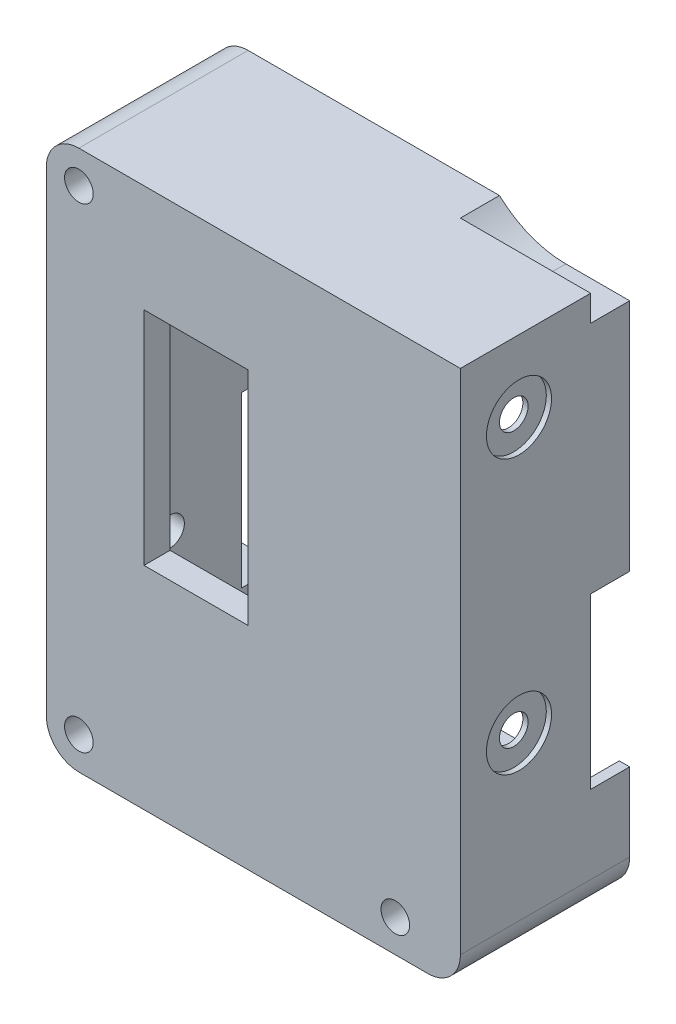
ISO-10303-21;
HEADER;
FILE_DESCRIPTION(('STEP AP214'),'2;1');
FILE_NAME('part.step','',(''),(''),'','','');
FILE_SCHEMA(('AUTOMOTIVE_DESIGN { 1 0 10303 214 1 1 1 1 }'));
ENDSEC;
DATA;
#1=APPLICATION_CONTEXT('core data for automotive mechanical design processes');
#2=APPLICATION_PROTOCOL_DEFINITION('international standard','automotive_design',2000,#1);
#3=PRODUCT_CONTEXT('',#1,'mechanical');
#4=PRODUCT('Part','Part','',(#3));
#5=PRODUCT_RELATED_PRODUCT_CATEGORY('part','',(#4));
#6=PRODUCT_DEFINITION_FORMATION('','',#4);
#7=PRODUCT_DEFINITION_CONTEXT('part definition',#1,'design');
#8=PRODUCT_DEFINITION('design','',#6,#7);
#9=PRODUCT_DEFINITION_SHAPE('','',#8);
#10=(LENGTH_UNIT() NAMED_UNIT(*) SI_UNIT(.MILLI.,.METRE.));
#11=(NAMED_UNIT(*) PLANE_ANGLE_UNIT() SI_UNIT($,.RADIAN.));
#12=(NAMED_UNIT(*) SI_UNIT($,.STERADIAN.) SOLID_ANGLE_UNIT());
#13=UNCERTAINTY_MEASURE_WITH_UNIT(LENGTH_MEASURE(1.E-05),#10,'distance_accuracy_value','');
#14=(GEOMETRIC_REPRESENTATION_CONTEXT(3) GLOBAL_UNCERTAINTY_ASSIGNED_CONTEXT((#13)) GLOBAL_UNIT_ASSIGNED_CONTEXT((#10,
#11,#12)) REPRESENTATION_CONTEXT('',''));
#15=CARTESIAN_POINT('',(0.,0.,0.));
#16=DIRECTION('',(0.,0.,1.));
#17=DIRECTION('',(1.,0.,0.));
#18=AXIS2_PLACEMENT_3D('',#15,#16,#17);
#19=CARTESIAN_POINT('',(24.3,-3.5,0.));
#20=DIRECTION('',(0.,0.,-1.));
#21=DIRECTION('',(-1.,0.,0.));
#22=AXIS2_PLACEMENT_3D('',#19,#20,#21);
#23=PLANE('',#22);
#24=CARTESIAN_POINT('',(-2.5,-3.5,0.));
#25=DIRECTION('',(0.,0.,1.));
#26=DIRECTION('',(1.,0.,0.));
#27=AXIS2_PLACEMENT_3D('',#24,#25,#26);
#28=CIRCLE('',#27,1.1);
#29=CARTESIAN_POINT('',(-1.4,-3.5,0.));
#30=VERTEX_POINT('',#29);
#31=EDGE_CURVE('E417',#30,#30,#28,.T.);
#32=ORIENTED_EDGE('',*,*,#31,.T.);
#33=EDGE_LOOP('',(#32));
#34=FACE_BOUND('',#33,.T.);
#35=CARTESIAN_POINT('',(-2.5,33.,0.));
#36=DIRECTION('',(0.,0.,1.));
#37=DIRECTION('',(1.,0.,0.));
#38=AXIS2_PLACEMENT_3D('',#35,#36,#37);
#39=CIRCLE('',#38,1.1);
#40=CARTESIAN_POINT('',(-1.4,33.,0.));
#41=VERTEX_POINT('',#40);
#42=EDGE_CURVE('E420',#41,#41,#39,.T.);
#43=ORIENTED_EDGE('',*,*,#42,.T.);
#44=EDGE_LOOP('',(#43));
#45=FACE_BOUND('',#44,.T.);
#46=CARTESIAN_POINT('',(21.8,-3.5,0.));
#47=DIRECTION('',(0.,0.,1.));
#48=DIRECTION('',(1.,0.,0.));
#49=AXIS2_PLACEMENT_3D('',#46,#47,#48);
#50=CIRCLE('',#49,1.1);
#51=CARTESIAN_POINT('',(22.9,-3.5,0.));
#52=VERTEX_POINT('',#51);
#53=EDGE_CURVE('E414',#52,#52,#50,.T.);
#54=ORIENTED_EDGE('',*,*,#53,.T.);
#55=EDGE_LOOP('',(#54));
#56=FACE_BOUND('',#55,.T.);
#57=DIRECTION('',(0.,1.,0.));
#58=VECTOR('',#57,1.);
#59=CARTESIAN_POINT('',(26.,0.,0.));
#60=LINE('',#59,#58);
#61=CARTESIAN_POINT('',(26.,0.,0.));
#62=VERTEX_POINT('',#61);
#63=CARTESIAN_POINT('',(26.,2.5,0.));
#64=VERTEX_POINT('',#63);
#65=EDGE_CURVE('E225',#62,#64,#60,.T.);
#66=ORIENTED_EDGE('',*,*,#65,.T.);
#67=DIRECTION('',(-1.,0.,0.));
#68=VECTOR('',#67,1.);
#69=CARTESIAN_POINT('',(26.8,2.5,0.));
#70=LINE('',#69,#68);
#71=CARTESIAN_POINT('',(26.8,2.5,0.));
#72=VERTEX_POINT('',#71);
#73=EDGE_CURVE('E211',#72,#64,#70,.T.);
#74=ORIENTED_EDGE('',*,*,#73,.F.);
#75=DIRECTION('',(0.,1.,0.));
#76=VECTOR('',#75,1.);
#77=CARTESIAN_POINT('',(26.8,35.5,0.));
#78=LINE('',#77,#76);
#79=CARTESIAN_POINT('',(26.8,-3.5,0.));
#80=VERTEX_POINT('',#79);
#81=EDGE_CURVE('E221',#80,#72,#78,.T.);
#82=ORIENTED_EDGE('',*,*,#81,.F.);
#83=CARTESIAN_POINT('',(24.3,-3.5,0.));
#84=DIRECTION('',(0.,0.,1.));
#85=DIRECTION('',(-1.,0.,0.));
#86=AXIS2_PLACEMENT_3D('',#83,#84,#85);
#87=CIRCLE('',#86,2.5);
#88=CARTESIAN_POINT('',(24.3,-6.,0.));
#89=VERTEX_POINT('',#88);
#90=EDGE_CURVE('E238',#89,#80,#87,.T.);
#91=ORIENTED_EDGE('',*,*,#90,.F.);
#92=DIRECTION('',(1.,0.,0.));
#93=VECTOR('',#92,1.);
#94=CARTESIAN_POINT('',(24.3,-6.,0.));
#95=LINE('',#94,#93);
#96=CARTESIAN_POINT('',(-2.5,-6.,0.));
#97=VERTEX_POINT('',#96);
#98=EDGE_CURVE('E247',#97,#89,#95,.T.);
#99=ORIENTED_EDGE('',*,*,#98,.F.);
#100=CARTESIAN_POINT('',(-2.5,-3.5,0.));
#101=DIRECTION('',(0.,0.,1.));
#102=DIRECTION('',(1.,0.,0.));
#103=AXIS2_PLACEMENT_3D('',#100,#101,#102);
#104=CIRCLE('',#103,2.5);
#105=CARTESIAN_POINT('',(-5.,-3.5,0.));
#106=VERTEX_POINT('',#105);
#107=EDGE_CURVE('E245',#106,#97,#104,.T.);
#108=ORIENTED_EDGE('',*,*,#107,.F.);
#109=DIRECTION('',(0.,-1.,0.));
#110=VECTOR('',#109,1.);
#111=CARTESIAN_POINT('',(-5.,-3.5,0.));
#112=LINE('',#111,#110);
#113=CARTESIAN_POINT('',(-5.,33.,0.));
#114=VERTEX_POINT('',#113);
#115=EDGE_CURVE('E243',#114,#106,#112,.T.);
#116=ORIENTED_EDGE('',*,*,#115,.F.);
#117=CARTESIAN_POINT('',(-2.5,33.,0.));
#118=DIRECTION('',(0.,0.,1.));
#119=DIRECTION('',(-1.,0.,0.));
#120=AXIS2_PLACEMENT_3D('',#117,#118,#119);
#121=CIRCLE('',#120,2.5);
#122=CARTESIAN_POINT('',(-2.5,35.5,0.));
#123=VERTEX_POINT('',#122);
#124=EDGE_CURVE('E236',#123,#114,#121,.T.);
#125=ORIENTED_EDGE('',*,*,#124,.F.);
#126=DIRECTION('',(-1.,0.,0.));
#127=VECTOR('',#126,1.);
#128=CARTESIAN_POINT('',(-2.5,35.5,0.));
#129=LINE('',#128,#127);
#130=CARTESIAN_POINT('',(16.8,35.5,0.));
#131=VERTEX_POINT('',#130);
#132=EDGE_CURVE('E233',#131,#123,#129,.T.);
#133=ORIENTED_EDGE('',*,*,#132,.F.);
#134=CARTESIAN_POINT('',(21.8990195135928,41.,0.));
#135=DIRECTION('',(0.,0.,-1.));
#136=DIRECTION('',(-1.,0.,0.));
#137=AXIS2_PLACEMENT_3D('',#134,#135,#136);
#138=CIRCLE('',#137,7.5);
#139=CARTESIAN_POINT('',(21.8990195135928,33.5,0.));
#140=VERTEX_POINT('',#139);
#141=EDGE_CURVE('E12',#131,#140,#138,.F.);
#142=ORIENTED_EDGE('',*,*,#141,.T.);
#143=DIRECTION('',(-1.,0.,0.));
#144=VECTOR('',#143,1.);
#145=CARTESIAN_POINT('',(26.8,33.5,0.));
#146=LINE('',#145,#144);
#147=CARTESIAN_POINT('',(26.8,33.5,0.));
#148=VERTEX_POINT('',#147);
#149=EDGE_CURVE('E311',#148,#140,#146,.T.);
#150=ORIENTED_EDGE('',*,*,#149,.F.);
#151=CARTESIAN_POINT('',(26.8,15.5,0.));
#152=VERTEX_POINT('',#151);
#153=EDGE_CURVE('E234',#152,#148,#78,.T.);
#154=ORIENTED_EDGE('',*,*,#153,.F.);
#155=DIRECTION('',(-1.,0.,0.));
#156=VECTOR('',#155,1.);
#157=CARTESIAN_POINT('',(26.8,15.5,0.));
#158=LINE('',#157,#156);
#159=CARTESIAN_POINT('',(26.,15.5,0.));
#160=VERTEX_POINT('',#159);
#161=EDGE_CURVE('E227',#152,#160,#158,.T.);
#162=ORIENTED_EDGE('',*,*,#161,.T.);
#163=CARTESIAN_POINT('',(26.,32.5,0.));
#164=VERTEX_POINT('',#163);
#165=EDGE_CURVE('E443',#160,#164,#60,.T.);
#166=ORIENTED_EDGE('',*,*,#165,.T.);
#167=DIRECTION('',(-1.,0.,0.));
#168=VECTOR('',#167,1.);
#169=CARTESIAN_POINT('',(0.,32.5,0.));
#170=LINE('',#169,#168);
#171=CARTESIAN_POINT('',(0.,32.5,0.));
#172=VERTEX_POINT('',#171);
#173=EDGE_CURVE('E428',#164,#172,#170,.T.);
#174=ORIENTED_EDGE('',*,*,#173,.T.);
#175=DIRECTION('',(0.,-1.,0.));
#176=VECTOR('',#175,1.);
#177=CARTESIAN_POINT('',(0.,0.,0.));
#178=LINE('',#177,#176);
#179=CARTESIAN_POINT('',(0.,15.5,0.));
#180=VERTEX_POINT('',#179);
#181=EDGE_CURVE('E438',#172,#180,#178,.T.);
#182=ORIENTED_EDGE('',*,*,#181,.T.);
#183=DIRECTION('',(1.,0.,0.));
#184=VECTOR('',#183,1.);
#185=CARTESIAN_POINT('',(0.,15.5,0.));
#186=LINE('',#185,#184);
#187=CARTESIAN_POINT('',(-3.5,15.5,0.));
#188=VERTEX_POINT('',#187);
#189=EDGE_CURVE('E317',#188,#180,#186,.T.);
#190=ORIENTED_EDGE('',*,*,#189,.F.);
#191=DIRECTION('',(0.,1.,0.));
#192=VECTOR('',#191,1.);
#193=CARTESIAN_POINT('',(-3.5,15.5,0.));
#194=LINE('',#193,#192);
#195=CARTESIAN_POINT('',(-3.5,2.5,0.));
#196=VERTEX_POINT('',#195);
#197=EDGE_CURVE('E329',#196,#188,#194,.T.);
#198=ORIENTED_EDGE('',*,*,#197,.F.);
#199=DIRECTION('',(-1.,0.,0.));
#200=VECTOR('',#199,1.);
#201=CARTESIAN_POINT('',(0.,2.5,0.));
#202=LINE('',#201,#200);
#203=CARTESIAN_POINT('',(0.,2.5,0.));
#204=VERTEX_POINT('',#203);
#205=EDGE_CURVE('E326',#204,#196,#202,.T.);
#206=ORIENTED_EDGE('',*,*,#205,.F.);
#207=CARTESIAN_POINT('',(0.,0.,0.));
#208=VERTEX_POINT('',#207);
#209=EDGE_CURVE('E423',#204,#208,#178,.T.);
#210=ORIENTED_EDGE('',*,*,#209,.T.);
#211=DIRECTION('',(1.,0.,0.));
#212=VECTOR('',#211,1.);
#213=CARTESIAN_POINT('',(0.,0.,0.));
#214=LINE('',#213,#212);
#215=EDGE_CURVE('E441',#208,#62,#214,.T.);
#216=ORIENTED_EDGE('',*,*,#215,.T.);
#217=EDGE_LOOP('',(#66,#74,#82,#91,#99,#108,#116,#125,#133,#142,#150,#154,#162,#166,#174,#182,
#190,#198,#206,#210,#216));
#218=FACE_BOUND('',#217,.T.);
#219=ADVANCED_FACE('F36',(#34,#45,#56,#218),#23,.T.);
#220=CARTESIAN_POINT('',(26.8,35.5,11.));
#221=DIRECTION('',(-1.,0.,0.));
#222=DIRECTION('',(0.,-1.,0.));
#223=AXIS2_PLACEMENT_3D('',#220,#221,#222);
#224=PLANE('',#223);
#225=CARTESIAN_POINT('',(26.8,9.,8.5));
#226=DIRECTION('',(1.,0.,0.));
#227=DIRECTION('',(0.,0.,-1.));
#228=AXIS2_PLACEMENT_3D('',#225,#226,#227);
#229=CIRCLE('',#228,2.5);
#230=CARTESIAN_POINT('',(26.8,9.,6.));
#231=VERTEX_POINT('',#230);
#232=EDGE_CURVE('E303',#231,#231,#229,.T.);
#233=ORIENTED_EDGE('',*,*,#232,.F.);
#234=EDGE_LOOP('',(#233));
#235=FACE_BOUND('',#234,.T.);
#236=CARTESIAN_POINT('',(26.8,30.,8.5));
#237=DIRECTION('',(1.,0.,0.));
#238=DIRECTION('',(0.,0.,-1.));
#239=AXIS2_PLACEMENT_3D('',#236,#237,#238);
#240=CIRCLE('',#239,2.5);
#241=CARTESIAN_POINT('',(26.8,30.,6.));
#242=VERTEX_POINT('',#241);
#243=EDGE_CURVE('E344',#242,#242,#240,.T.);
#244=ORIENTED_EDGE('',*,*,#243,.F.);
#245=EDGE_LOOP('',(#244));
#246=FACE_BOUND('',#245,.T.);
#247=DIRECTION('',(0.,0.,-1.));
#248=VECTOR('',#247,1.);
#249=CARTESIAN_POINT('',(26.8,2.5,3.));
#250=LINE('',#249,#248);
#251=CARTESIAN_POINT('',(26.8,2.5,3.));
#252=VERTEX_POINT('',#251);
#253=EDGE_CURVE('E208',#252,#72,#250,.T.);
#254=ORIENTED_EDGE('',*,*,#253,.F.);
#255=DIRECTION('',(0.,-1.,0.));
#256=VECTOR('',#255,1.);
#257=CARTESIAN_POINT('',(26.8,15.5,3.));
#258=LINE('',#257,#256);
#259=CARTESIAN_POINT('',(26.8,15.5,3.));
#260=VERTEX_POINT('',#259);
#261=EDGE_CURVE('E498',#260,#252,#258,.T.);
#262=ORIENTED_EDGE('',*,*,#261,.F.);
#263=DIRECTION('',(0.,0.,1.));
#264=VECTOR('',#263,1.);
#265=CARTESIAN_POINT('',(26.8,15.5,0.));
#266=LINE('',#265,#264);
#267=EDGE_CURVE('E216',#152,#260,#266,.T.);
#268=ORIENTED_EDGE('',*,*,#267,.F.);
#269=ORIENTED_EDGE('',*,*,#153,.T.);
#270=DIRECTION('',(0.,0.,-1.));
#271=VECTOR('',#270,1.);
#272=CARTESIAN_POINT('',(26.8,33.5,3.));
#273=LINE('',#272,#271);
#274=CARTESIAN_POINT('',(26.8,33.5,3.));
#275=VERTEX_POINT('',#274);
#276=EDGE_CURVE('E301',#275,#148,#273,.T.);
#277=ORIENTED_EDGE('',*,*,#276,.F.);
#278=DIRECTION('',(0.,-1.,0.));
#279=VECTOR('',#278,1.);
#280=CARTESIAN_POINT('',(26.8,35.5,3.));
#281=LINE('',#280,#279);
#282=CARTESIAN_POINT('',(26.8,35.5,3.));
#283=VERTEX_POINT('',#282);
#284=EDGE_CURVE('E482',#283,#275,#281,.T.);
#285=ORIENTED_EDGE('',*,*,#284,.F.);
#286=DIRECTION('',(0.,0.,-1.));
#287=VECTOR('',#286,1.);
#288=CARTESIAN_POINT('',(26.8,35.5,11.));
#289=LINE('',#288,#287);
#290=CARTESIAN_POINT('',(26.8,35.5,13.));
#291=VERTEX_POINT('',#290);
#292=EDGE_CURVE('E264',#291,#283,#289,.T.);
#293=ORIENTED_EDGE('',*,*,#292,.F.);
#294=DIRECTION('',(0.,-1.,0.));
#295=VECTOR('',#294,1.);
#296=CARTESIAN_POINT('',(26.8,35.5,13.));
#297=LINE('',#296,#295);
#298=CARTESIAN_POINT('',(26.8,-3.5,13.));
#299=VERTEX_POINT('',#298);
#300=EDGE_CURVE('E406',#291,#299,#297,.T.);
#301=ORIENTED_EDGE('',*,*,#300,.T.);
#302=DIRECTION('',(0.,0.,-1.));
#303=VECTOR('',#302,1.);
#304=CARTESIAN_POINT('',(26.8,-3.5,11.));
#305=LINE('',#304,#303);
#306=EDGE_CURVE('E231',#299,#80,#305,.T.);
#307=ORIENTED_EDGE('',*,*,#306,.T.);
#308=ORIENTED_EDGE('',*,*,#81,.T.);
#309=EDGE_LOOP('',(#254,#262,#268,#269,#277,#285,#293,#301,#307,#308));
#310=FACE_BOUND('',#309,.T.);
#311=ADVANCED_FACE('F229',(#235,#246,#310),#224,.F.);
#312=CARTESIAN_POINT('',(26.,0.,11.));
#313=DIRECTION('',(-1.,0.,0.));
#314=DIRECTION('',(0.,0.,1.));
#315=AXIS2_PLACEMENT_3D('',#312,#313,#314);
#316=PLANE('',#315);
#317=CARTESIAN_POINT('',(26.,30.,8.5));
#318=DIRECTION('',(-1.,0.,0.));
#319=DIRECTION('',(0.,0.,1.));
#320=AXIS2_PLACEMENT_3D('',#317,#318,#319);
#321=CIRCLE('',#320,1.1);
#322=CARTESIAN_POINT('',(26.,30.,9.6));
#323=VERTEX_POINT('',#322);
#324=EDGE_CURVE('E273',#323,#323,#321,.T.);
#325=ORIENTED_EDGE('',*,*,#324,.F.);
#326=EDGE_LOOP('',(#325));
#327=FACE_BOUND('',#326,.T.);
#328=CARTESIAN_POINT('',(26.,9.,8.5));
#329=DIRECTION('',(-1.,0.,0.));
#330=DIRECTION('',(0.,0.,1.));
#331=AXIS2_PLACEMENT_3D('',#328,#329,#330);
#332=CIRCLE('',#331,1.1);
#333=CARTESIAN_POINT('',(26.,9.,9.6));
#334=VERTEX_POINT('',#333);
#335=EDGE_CURVE('E268',#334,#334,#332,.T.);
#336=ORIENTED_EDGE('',*,*,#335,.F.);
#337=EDGE_LOOP('',(#336));
#338=FACE_BOUND('',#337,.T.);
#339=DIRECTION('',(0.,-1.,0.));
#340=VECTOR('',#339,1.);
#341=CARTESIAN_POINT('',(26.,0.,3.));
#342=LINE('',#341,#340);
#343=CARTESIAN_POINT('',(26.,15.5,3.));
#344=VERTEX_POINT('',#343);
#345=CARTESIAN_POINT('',(26.,2.5,3.));
#346=VERTEX_POINT('',#345);
#347=EDGE_CURVE('E330',#344,#346,#342,.T.);
#348=ORIENTED_EDGE('',*,*,#347,.T.);
#349=DIRECTION('',(0.,0.,-1.));
#350=VECTOR('',#349,1.);
#351=CARTESIAN_POINT('',(26.,2.5,11.));
#352=LINE('',#351,#350);
#353=EDGE_CURVE('E488',#346,#64,#352,.T.);
#354=ORIENTED_EDGE('',*,*,#353,.T.);
#355=ORIENTED_EDGE('',*,*,#65,.F.);
#356=DIRECTION('',(0.,0.,-1.));
#357=VECTOR('',#356,1.);
#358=CARTESIAN_POINT('',(26.,0.,11.));
#359=LINE('',#358,#357);
#360=CARTESIAN_POINT('',(26.,0.,11.));
#361=VERTEX_POINT('',#360);
#362=EDGE_CURVE('E452',#361,#62,#359,.T.);
#363=ORIENTED_EDGE('',*,*,#362,.F.);
#364=DIRECTION('',(0.,1.,0.));
#365=VECTOR('',#364,1.);
#366=CARTESIAN_POINT('',(26.,0.,11.));
#367=LINE('',#366,#365);
#368=CARTESIAN_POINT('',(26.,32.5,11.));
#369=VERTEX_POINT('',#368);
#370=EDGE_CURVE('E431',#361,#369,#367,.T.);
#371=ORIENTED_EDGE('',*,*,#370,.T.);
#372=DIRECTION('',(0.,0.,-1.));
#373=VECTOR('',#372,1.);
#374=CARTESIAN_POINT('',(26.,32.5,11.));
#375=LINE('',#374,#373);
#376=EDGE_CURVE('E449',#369,#164,#375,.T.);
#377=ORIENTED_EDGE('',*,*,#376,.T.);
#378=ORIENTED_EDGE('',*,*,#165,.F.);
#379=DIRECTION('',(0.,0.,1.));
#380=VECTOR('',#379,1.);
#381=CARTESIAN_POINT('',(26.,15.5,11.));
#382=LINE('',#381,#380);
#383=EDGE_CURVE('E226',#160,#344,#382,.T.);
#384=ORIENTED_EDGE('',*,*,#383,.T.);
#385=EDGE_LOOP('',(#348,#354,#355,#363,#371,#377,#378,#384));
#386=FACE_BOUND('',#385,.T.);
#387=ADVANCED_FACE('F507',(#327,#338,#386),#316,.T.);
#388=CARTESIAN_POINT('',(26.8,9.,8.5));
#389=DIRECTION('',(-1.,0.,0.));
#390=DIRECTION('',(0.,-1.,0.));
#391=AXIS2_PLACEMENT_3D('',#388,#389,#390);
#392=CYLINDRICAL_SURFACE('',#391,1.1);
#393=ORIENTED_EDGE('',*,*,#335,.T.);
#394=EDGE_LOOP('',(#393));
#395=FACE_BOUND('',#394,.T.);
#396=CARTESIAN_POINT('',(26.4,9.,8.5));
#397=DIRECTION('',(1.,0.,0.));
#398=DIRECTION('',(0.,0.,-1.));
#399=AXIS2_PLACEMENT_3D('',#396,#397,#398);
#400=CIRCLE('',#399,1.1);
#401=CARTESIAN_POINT('',(26.4,9.,7.4));
#402=VERTEX_POINT('',#401);
#403=EDGE_CURVE('E280',#402,#402,#400,.F.);
#404=ORIENTED_EDGE('',*,*,#403,.F.);
#405=EDGE_LOOP('',(#404));
#406=FACE_BOUND('',#405,.T.);
#407=ADVANCED_FACE('F551',(#395,#406),#392,.F.);
#408=CARTESIAN_POINT('',(26.8,30.,8.5));
#409=DIRECTION('',(-1.,0.,0.));
#410=DIRECTION('',(0.,-1.,0.));
#411=AXIS2_PLACEMENT_3D('',#408,#409,#410);
#412=CYLINDRICAL_SURFACE('',#411,1.1);
#413=ORIENTED_EDGE('',*,*,#324,.T.);
#414=EDGE_LOOP('',(#413));
#415=FACE_BOUND('',#414,.T.);
#416=CARTESIAN_POINT('',(26.4,30.,8.5));
#417=DIRECTION('',(1.,0.,0.));
#418=DIRECTION('',(0.,0.,-1.));
#419=AXIS2_PLACEMENT_3D('',#416,#417,#418);
#420=CIRCLE('',#419,1.1);
#421=CARTESIAN_POINT('',(26.4,30.,7.4));
#422=VERTEX_POINT('',#421);
#423=EDGE_CURVE('E277',#422,#422,#420,.F.);
#424=ORIENTED_EDGE('',*,*,#423,.F.);
#425=EDGE_LOOP('',(#424));
#426=FACE_BOUND('',#425,.T.);
#427=ADVANCED_FACE('F547',(#415,#426),#412,.F.);
#428=CARTESIAN_POINT('',(24.3,-3.5,11.));
#429=DIRECTION('',(0.,0.,-1.));
#430=DIRECTION('',(-1.,0.,0.));
#431=AXIS2_PLACEMENT_3D('',#428,#429,#430);
#432=CYLINDRICAL_SURFACE('',#431,2.5);
#433=ORIENTED_EDGE('',*,*,#90,.T.);
#434=ORIENTED_EDGE('',*,*,#306,.F.);
#435=CARTESIAN_POINT('',(24.3,-3.5,13.));
#436=DIRECTION('',(0.,0.,-1.));
#437=DIRECTION('',(-1.,0.,0.));
#438=AXIS2_PLACEMENT_3D('',#435,#436,#437);
#439=CIRCLE('',#438,2.5);
#440=CARTESIAN_POINT('',(24.3,-6.,13.));
#441=VERTEX_POINT('',#440);
#442=EDGE_CURVE('E408',#299,#441,#439,.T.);
#443=ORIENTED_EDGE('',*,*,#442,.T.);
#444=DIRECTION('',(0.,0.,-1.));
#445=VECTOR('',#444,1.);
#446=CARTESIAN_POINT('',(24.3,-6.,11.));
#447=LINE('',#446,#445);
#448=EDGE_CURVE('E249',#441,#89,#447,.T.);
#449=ORIENTED_EDGE('',*,*,#448,.T.);
#450=EDGE_LOOP('',(#433,#434,#443,#449));
#451=FACE_BOUND('',#450,.T.);
#452=ADVANCED_FACE('F459',(#451),#432,.T.);
#453=CARTESIAN_POINT('',(-2.5,35.5,11.));
#454=DIRECTION('',(0.,-1.,0.));
#455=DIRECTION('',(0.,0.,-1.));
#456=AXIS2_PLACEMENT_3D('',#453,#454,#455);
#457=PLANE('',#456);
#458=DIRECTION('',(1.,0.,0.));
#459=VECTOR('',#458,1.);
#460=CARTESIAN_POINT('',(26.8,35.5,3.));
#461=LINE('',#460,#459);
#462=CARTESIAN_POINT('',(16.8,35.5,3.));
#463=VERTEX_POINT('',#462);
#464=EDGE_CURVE('E290',#463,#283,#461,.T.);
#465=ORIENTED_EDGE('',*,*,#464,.F.);
#466=DIRECTION('',(0.,0.,-1.));
#467=VECTOR('',#466,1.);
#468=CARTESIAN_POINT('',(16.8,35.5,3.));
#469=LINE('',#468,#467);
#470=EDGE_CURVE('E298',#463,#131,#469,.T.);
#471=ORIENTED_EDGE('',*,*,#470,.T.);
#472=ORIENTED_EDGE('',*,*,#132,.T.);
#473=DIRECTION('',(0.,0.,-1.));
#474=VECTOR('',#473,1.);
#475=CARTESIAN_POINT('',(-2.5,35.5,11.));
#476=LINE('',#475,#474);
#477=CARTESIAN_POINT('',(-2.5,35.5,13.));
#478=VERTEX_POINT('',#477);
#479=EDGE_CURVE('E261',#478,#123,#476,.T.);
#480=ORIENTED_EDGE('',*,*,#479,.F.);
#481=DIRECTION('',(1.,0.,0.));
#482=VECTOR('',#481,1.);
#483=CARTESIAN_POINT('',(-2.5,35.5,13.));
#484=LINE('',#483,#482);
#485=EDGE_CURVE('E404',#478,#291,#484,.T.);
#486=ORIENTED_EDGE('',*,*,#485,.T.);
#487=ORIENTED_EDGE('',*,*,#292,.T.);
#488=EDGE_LOOP('',(#465,#471,#472,#480,#486,#487));
#489=FACE_BOUND('',#488,.T.);
#490=ADVANCED_FACE('F297',(#489),#457,.F.);
#491=CARTESIAN_POINT('',(-2.5,33.,11.));
#492=DIRECTION('',(0.,0.,-1.));
#493=DIRECTION('',(-1.,0.,0.));
#494=AXIS2_PLACEMENT_3D('',#491,#492,#493);
#495=CYLINDRICAL_SURFACE('',#494,2.5);
#496=ORIENTED_EDGE('',*,*,#124,.T.);
#497=DIRECTION('',(0.,0.,-1.));
#498=VECTOR('',#497,1.);
#499=CARTESIAN_POINT('',(-5.,33.,11.));
#500=LINE('',#499,#498);
#501=CARTESIAN_POINT('',(-5.,33.,13.));
#502=VERTEX_POINT('',#501);
#503=EDGE_CURVE('E258',#502,#114,#500,.T.);
#504=ORIENTED_EDGE('',*,*,#503,.F.);
#505=CARTESIAN_POINT('',(-2.5,33.,13.));
#506=DIRECTION('',(0.,0.,-1.));
#507=DIRECTION('',(-1.,0.,0.));
#508=AXIS2_PLACEMENT_3D('',#505,#506,#507);
#509=CIRCLE('',#508,2.5);
#510=EDGE_CURVE('E401',#502,#478,#509,.T.);
#511=ORIENTED_EDGE('',*,*,#510,.T.);
#512=ORIENTED_EDGE('',*,*,#479,.T.);
#513=EDGE_LOOP('',(#496,#504,#511,#512));
#514=FACE_BOUND('',#513,.T.);
#515=ADVANCED_FACE('F479',(#514),#495,.T.);
#516=CARTESIAN_POINT('',(-5.,-3.5,11.));
#517=DIRECTION('',(1.,0.,0.));
#518=DIRECTION('',(0.,1.,0.));
#519=AXIS2_PLACEMENT_3D('',#516,#517,#518);
#520=PLANE('',#519);
#521=CARTESIAN_POINT('',(-5.,30.,8.5));
#522=DIRECTION('',(-1.,0.,0.));
#523=DIRECTION('',(0.,-1.,0.));
#524=AXIS2_PLACEMENT_3D('',#521,#522,#523);
#525=CIRCLE('',#524,1.1);
#526=CARTESIAN_POINT('',(-5.,28.9,8.5));
#527=VERTEX_POINT('',#526);
#528=EDGE_CURVE('E272',#527,#527,#525,.T.);
#529=ORIENTED_EDGE('',*,*,#528,.F.);
#530=EDGE_LOOP('',(#529));
#531=FACE_BOUND('',#530,.T.);
#532=CARTESIAN_POINT('',(-5.,9.,8.5));
#533=DIRECTION('',(-1.,0.,0.));
#534=DIRECTION('',(0.,-1.,0.));
#535=AXIS2_PLACEMENT_3D('',#532,#533,#534);
#536=CIRCLE('',#535,1.1);
#537=CARTESIAN_POINT('',(-5.,7.9,8.5));
#538=VERTEX_POINT('',#537);
#539=EDGE_CURVE('E377',#538,#538,#536,.T.);
#540=ORIENTED_EDGE('',*,*,#539,.F.);
#541=EDGE_LOOP('',(#540));
#542=FACE_BOUND('',#541,.T.);
#543=ORIENTED_EDGE('',*,*,#115,.T.);
#544=DIRECTION('',(0.,0.,-1.));
#545=VECTOR('',#544,1.);
#546=CARTESIAN_POINT('',(-5.,-3.5,11.));
#547=LINE('',#546,#545);
#548=CARTESIAN_POINT('',(-5.,-3.5,13.));
#549=VERTEX_POINT('',#548);
#550=EDGE_CURVE('E255',#549,#106,#547,.T.);
#551=ORIENTED_EDGE('',*,*,#550,.F.);
#552=DIRECTION('',(0.,1.,0.));
#553=VECTOR('',#552,1.);
#554=CARTESIAN_POINT('',(-5.,-3.5,13.));
#555=LINE('',#554,#553);
#556=EDGE_CURVE('E398',#549,#502,#555,.T.);
#557=ORIENTED_EDGE('',*,*,#556,.T.);
#558=ORIENTED_EDGE('',*,*,#503,.T.);
#559=EDGE_LOOP('',(#543,#551,#557,#558));
#560=FACE_BOUND('',#559,.T.);
#561=ADVANCED_FACE('F476',(#531,#542,#560),#520,.F.);
#562=CARTESIAN_POINT('',(-2.5,-3.5,11.));
#563=DIRECTION('',(0.,0.,-1.));
#564=DIRECTION('',(-1.,0.,0.));
#565=AXIS2_PLACEMENT_3D('',#562,#563,#564);
#566=CYLINDRICAL_SURFACE('',#565,2.5);
#567=ORIENTED_EDGE('',*,*,#107,.T.);
#568=DIRECTION('',(0.,0.,-1.));
#569=VECTOR('',#568,1.);
#570=CARTESIAN_POINT('',(-2.5,-6.,11.));
#571=LINE('',#570,#569);
#572=CARTESIAN_POINT('',(-2.5,-6.,13.));
#573=VERTEX_POINT('',#572);
#574=EDGE_CURVE('E252',#573,#97,#571,.T.);
#575=ORIENTED_EDGE('',*,*,#574,.F.);
#576=CARTESIAN_POINT('',(-2.5,-3.5,13.));
#577=DIRECTION('',(0.,0.,-1.));
#578=DIRECTION('',(-1.,0.,0.));
#579=AXIS2_PLACEMENT_3D('',#576,#577,#578);
#580=CIRCLE('',#579,2.5);
#581=EDGE_CURVE('E395',#573,#549,#580,.T.);
#582=ORIENTED_EDGE('',*,*,#581,.T.);
#583=ORIENTED_EDGE('',*,*,#550,.T.);
#584=EDGE_LOOP('',(#567,#575,#582,#583));
#585=FACE_BOUND('',#584,.T.);
#586=ADVANCED_FACE('F469',(#585),#566,.T.);
#587=CARTESIAN_POINT('',(24.3,-6.,11.));
#588=DIRECTION('',(0.,1.,0.));
#589=DIRECTION('',(-1.,0.,0.));
#590=AXIS2_PLACEMENT_3D('',#587,#588,#589);
#591=PLANE('',#590);
#592=ORIENTED_EDGE('',*,*,#98,.T.);
#593=ORIENTED_EDGE('',*,*,#448,.F.);
#594=DIRECTION('',(-1.,0.,0.));
#595=VECTOR('',#594,1.);
#596=CARTESIAN_POINT('',(24.3,-6.,13.));
#597=LINE('',#596,#595);
#598=EDGE_CURVE('E411',#441,#573,#597,.T.);
#599=ORIENTED_EDGE('',*,*,#598,.T.);
#600=ORIENTED_EDGE('',*,*,#574,.T.);
#601=EDGE_LOOP('',(#592,#593,#599,#600));
#602=FACE_BOUND('',#601,.T.);
#603=ADVANCED_FACE('F465',(#602),#591,.F.);
#604=CARTESIAN_POINT('',(0.,0.,11.));
#605=DIRECTION('',(1.,0.,0.));
#606=DIRECTION('',(0.,0.,-1.));
#607=AXIS2_PLACEMENT_3D('',#604,#605,#606);
#608=PLANE('',#607);
#609=DIRECTION('',(0.,0.,-1.));
#610=VECTOR('',#609,1.);
#611=CARTESIAN_POINT('',(0.,15.5,3.));
#612=LINE('',#611,#610);
#613=CARTESIAN_POINT('',(0.,15.5,3.));
#614=VERTEX_POINT('',#613);
#615=EDGE_CURVE('E334',#614,#180,#612,.T.);
#616=ORIENTED_EDGE('',*,*,#615,.T.);
#617=ORIENTED_EDGE('',*,*,#181,.F.);
#618=DIRECTION('',(0.,0.,-1.));
#619=VECTOR('',#618,1.);
#620=CARTESIAN_POINT('',(0.,32.5,11.));
#621=LINE('',#620,#619);
#622=CARTESIAN_POINT('',(0.,32.5,11.));
#623=VERTEX_POINT('',#622);
#624=EDGE_CURVE('E437',#623,#172,#621,.T.);
#625=ORIENTED_EDGE('',*,*,#624,.F.);
#626=DIRECTION('',(0.,-1.,0.));
#627=VECTOR('',#626,1.);
#628=CARTESIAN_POINT('',(0.,0.,11.));
#629=LINE('',#628,#627);
#630=CARTESIAN_POINT('',(0.,0.,11.));
#631=VERTEX_POINT('',#630);
#632=EDGE_CURVE('E424',#623,#631,#629,.T.);
#633=ORIENTED_EDGE('',*,*,#632,.T.);
#634=DIRECTION('',(0.,0.,-1.));
#635=VECTOR('',#634,1.);
#636=CARTESIAN_POINT('',(0.,0.,11.));
#637=LINE('',#636,#635);
#638=EDGE_CURVE('E453',#631,#208,#637,.T.);
#639=ORIENTED_EDGE('',*,*,#638,.T.);
#640=ORIENTED_EDGE('',*,*,#209,.F.);
#641=DIRECTION('',(0.,0.,-1.));
#642=VECTOR('',#641,1.);
#643=CARTESIAN_POINT('',(0.,2.5,3.));
#644=LINE('',#643,#642);
#645=CARTESIAN_POINT('',(0.,2.5,3.));
#646=VERTEX_POINT('',#645);
#647=EDGE_CURVE('E325',#646,#204,#644,.T.);
#648=ORIENTED_EDGE('',*,*,#647,.F.);
#649=DIRECTION('',(0.,-1.,0.));
#650=VECTOR('',#649,1.);
#651=CARTESIAN_POINT('',(0.,15.5,3.));
#652=LINE('',#651,#650);
#653=EDGE_CURVE('E313',#614,#646,#652,.T.);
#654=ORIENTED_EDGE('',*,*,#653,.F.);
#655=EDGE_LOOP('',(#616,#617,#625,#633,#639,#640,#648,#654));
#656=FACE_BOUND('',#655,.T.);
#657=CARTESIAN_POINT('',(0.,30.,8.5));
#658=DIRECTION('',(1.,0.,0.));
#659=DIRECTION('',(0.,0.,-1.));
#660=AXIS2_PLACEMENT_3D('',#657,#658,#659);
#661=CIRCLE('',#660,1.1);
#662=CARTESIAN_POINT('',(0.,30.,7.4));
#663=VERTEX_POINT('',#662);
#664=EDGE_CURVE('E276',#663,#663,#661,.T.);
#665=ORIENTED_EDGE('',*,*,#664,.F.);
#666=EDGE_LOOP('',(#665));
#667=FACE_BOUND('',#666,.T.);
#668=CARTESIAN_POINT('',(0.,9.,8.5));
#669=DIRECTION('',(1.,0.,0.));
#670=DIRECTION('',(0.,0.,-1.));
#671=AXIS2_PLACEMENT_3D('',#668,#669,#670);
#672=CIRCLE('',#671,1.1);
#673=CARTESIAN_POINT('',(0.,9.,7.4));
#674=VERTEX_POINT('',#673);
#675=EDGE_CURVE('E271',#674,#674,#672,.T.);
#676=ORIENTED_EDGE('',*,*,#675,.F.);
#677=EDGE_LOOP('',(#676));
#678=FACE_BOUND('',#677,.T.);
#679=ADVANCED_FACE('F534',(#656,#667,#678),#608,.T.);
#680=CARTESIAN_POINT('',(0.,0.,11.));
#681=DIRECTION('',(0.,1.,0.));
#682=DIRECTION('',(0.,0.,1.));
#683=AXIS2_PLACEMENT_3D('',#680,#681,#682);
#684=PLANE('',#683);
#685=ORIENTED_EDGE('',*,*,#215,.F.);
#686=ORIENTED_EDGE('',*,*,#638,.F.);
#687=DIRECTION('',(1.,0.,0.));
#688=VECTOR('',#687,1.);
#689=CARTESIAN_POINT('',(0.,0.,11.));
#690=LINE('',#689,#688);
#691=EDGE_CURVE('E427',#631,#361,#690,.T.);
#692=ORIENTED_EDGE('',*,*,#691,.T.);
#693=ORIENTED_EDGE('',*,*,#362,.T.);
#694=EDGE_LOOP('',(#685,#686,#692,#693));
#695=FACE_BOUND('',#694,.T.);
#696=ADVANCED_FACE('F582',(#695),#684,.T.);
#697=CARTESIAN_POINT('',(0.,32.5,11.));
#698=DIRECTION('',(0.,-1.,0.));
#699=DIRECTION('',(0.,0.,-1.));
#700=AXIS2_PLACEMENT_3D('',#697,#698,#699);
#701=PLANE('',#700);
#702=ORIENTED_EDGE('',*,*,#173,.F.);
#703=ORIENTED_EDGE('',*,*,#376,.F.);
#704=DIRECTION('',(-1.,0.,0.));
#705=VECTOR('',#704,1.);
#706=CARTESIAN_POINT('',(0.,32.5,11.));
#707=LINE('',#706,#705);
#708=EDGE_CURVE('E434',#369,#623,#707,.T.);
#709=ORIENTED_EDGE('',*,*,#708,.T.);
#710=ORIENTED_EDGE('',*,*,#624,.T.);
#711=EDGE_LOOP('',(#702,#703,#709,#710));
#712=FACE_BOUND('',#711,.T.);
#713=ADVANCED_FACE('F587',(#712),#701,.T.);
#714=CARTESIAN_POINT('',(-2.5,33.,11.));
#715=DIRECTION('',(0.,0.,-1.));
#716=DIRECTION('',(-1.,0.,0.));
#717=AXIS2_PLACEMENT_3D('',#714,#715,#716);
#718=CYLINDRICAL_SURFACE('',#717,1.1);
#719=ORIENTED_EDGE('',*,*,#42,.F.);
#720=EDGE_LOOP('',(#719));
#721=FACE_BOUND('',#720,.T.);
#722=CARTESIAN_POINT('',(-2.5,33.,13.));
#723=DIRECTION('',(0.,0.,-1.));
#724=DIRECTION('',(-1.,0.,0.));
#725=AXIS2_PLACEMENT_3D('',#722,#723,#724);
#726=CIRCLE('',#725,1.1);
#727=CARTESIAN_POINT('',(-3.6,33.,13.));
#728=VERTEX_POINT('',#727);
#729=EDGE_CURVE('E386',#728,#728,#726,.T.);
#730=ORIENTED_EDGE('',*,*,#729,.F.);
#731=EDGE_LOOP('',(#730));
#732=FACE_BOUND('',#731,.T.);
#733=ADVANCED_FACE('F679',(#721,#732),#718,.F.);
#734=CARTESIAN_POINT('',(-2.5,-3.5,11.));
#735=DIRECTION('',(0.,0.,-1.));
#736=DIRECTION('',(-1.,0.,0.));
#737=AXIS2_PLACEMENT_3D('',#734,#735,#736);
#738=CYLINDRICAL_SURFACE('',#737,1.1);
#739=ORIENTED_EDGE('',*,*,#31,.F.);
#740=EDGE_LOOP('',(#739));
#741=FACE_BOUND('',#740,.T.);
#742=CARTESIAN_POINT('',(-2.5,-3.5,13.));
#743=DIRECTION('',(0.,0.,-1.));
#744=DIRECTION('',(-1.,0.,0.));
#745=AXIS2_PLACEMENT_3D('',#742,#743,#744);
#746=CIRCLE('',#745,1.1);
#747=CARTESIAN_POINT('',(-3.6,-3.5,13.));
#748=VERTEX_POINT('',#747);
#749=EDGE_CURVE('E389',#748,#748,#746,.T.);
#750=ORIENTED_EDGE('',*,*,#749,.F.);
#751=EDGE_LOOP('',(#750));
#752=FACE_BOUND('',#751,.T.);
#753=ADVANCED_FACE('F671',(#741,#752),#738,.F.);
#754=CARTESIAN_POINT('',(21.8,-3.5,11.));
#755=DIRECTION('',(0.,0.,-1.));
#756=DIRECTION('',(-1.,0.,0.));
#757=AXIS2_PLACEMENT_3D('',#754,#755,#756);
#758=CYLINDRICAL_SURFACE('',#757,1.1);
#759=ORIENTED_EDGE('',*,*,#53,.F.);
#760=EDGE_LOOP('',(#759));
#761=FACE_BOUND('',#760,.T.);
#762=CARTESIAN_POINT('',(21.8,-3.5,13.));
#763=DIRECTION('',(0.,0.,-1.));
#764=DIRECTION('',(-1.,0.,0.));
#765=AXIS2_PLACEMENT_3D('',#762,#763,#764);
#766=CIRCLE('',#765,1.1);
#767=CARTESIAN_POINT('',(20.7,-3.5,13.));
#768=VERTEX_POINT('',#767);
#769=EDGE_CURVE('E392',#768,#768,#766,.T.);
#770=ORIENTED_EDGE('',*,*,#769,.F.);
#771=EDGE_LOOP('',(#770));
#772=FACE_BOUND('',#771,.T.);
#773=ADVANCED_FACE('F669',(#761,#772),#758,.F.);
#774=CARTESIAN_POINT('',(-2.5,-3.5,11.));
#775=DIRECTION('',(0.,0.,-1.));
#776=DIRECTION('',(-1.,0.,0.));
#777=AXIS2_PLACEMENT_3D('',#774,#775,#776);
#778=PLANE('',#777);
#779=DIRECTION('',(0.,-1.,0.));
#780=VECTOR('',#779,1.);
#781=CARTESIAN_POINT('',(10.5,-3.5,11.));
#782=LINE('',#781,#780);
#783=CARTESIAN_POINT('',(10.5,27.25,11.));
#784=VERTEX_POINT('',#783);
#785=CARTESIAN_POINT('',(10.5,10.25,11.));
#786=VERTEX_POINT('',#785);
#787=EDGE_CURVE('E375',#784,#786,#782,.T.);
#788=ORIENTED_EDGE('',*,*,#787,.F.);
#789=DIRECTION('',(1.,0.,0.));
#790=VECTOR('',#789,1.);
#791=CARTESIAN_POINT('',(-2.5,27.25,11.));
#792=LINE('',#791,#790);
#793=CARTESIAN_POINT('',(2.5,27.25,11.));
#794=VERTEX_POINT('',#793);
#795=EDGE_CURVE('E362',#794,#784,#792,.T.);
#796=ORIENTED_EDGE('',*,*,#795,.F.);
#797=DIRECTION('',(0.,1.,0.));
#798=VECTOR('',#797,1.);
#799=CARTESIAN_POINT('',(2.5,-3.5,11.));
#800=LINE('',#799,#798);
#801=CARTESIAN_POINT('',(2.5,10.25,11.));
#802=VERTEX_POINT('',#801);
#803=EDGE_CURVE('E370',#802,#794,#800,.T.);
#804=ORIENTED_EDGE('',*,*,#803,.F.);
#805=DIRECTION('',(-1.,0.,0.));
#806=VECTOR('',#805,1.);
#807=CARTESIAN_POINT('',(-2.5,10.25,11.));
#808=LINE('',#807,#806);
#809=EDGE_CURVE('E373',#786,#802,#808,.T.);
#810=ORIENTED_EDGE('',*,*,#809,.F.);
#811=EDGE_LOOP('',(#788,#796,#804,#810));
#812=FACE_BOUND('',#811,.T.);
#813=ORIENTED_EDGE('',*,*,#632,.F.);
#814=ORIENTED_EDGE('',*,*,#708,.F.);
#815=ORIENTED_EDGE('',*,*,#370,.F.);
#816=ORIENTED_EDGE('',*,*,#691,.F.);
#817=EDGE_LOOP('',(#813,#814,#815,#816));
#818=FACE_BOUND('',#817,.T.);
#819=ADVANCED_FACE('F655',(#812,#818),#778,.T.);
#820=CARTESIAN_POINT('',(-2.5,-3.5,13.));
#821=DIRECTION('',(0.,0.,-1.));
#822=DIRECTION('',(-1.,0.,0.));
#823=AXIS2_PLACEMENT_3D('',#820,#821,#822);
#824=PLANE('',#823);
#825=DIRECTION('',(-1.,0.,0.));
#826=VECTOR('',#825,1.);
#827=CARTESIAN_POINT('',(10.5,27.25,13.));
#828=LINE('',#827,#826);
#829=CARTESIAN_POINT('',(10.5,27.25,13.));
#830=VERTEX_POINT('',#829);
#831=CARTESIAN_POINT('',(2.5,27.25,13.));
#832=VERTEX_POINT('',#831);
#833=EDGE_CURVE('E350',#830,#832,#828,.T.);
#834=ORIENTED_EDGE('',*,*,#833,.F.);
#835=DIRECTION('',(0.,1.,0.));
#836=VECTOR('',#835,1.);
#837=CARTESIAN_POINT('',(10.5,10.25,13.));
#838=LINE('',#837,#836);
#839=CARTESIAN_POINT('',(10.5,10.25,13.));
#840=VERTEX_POINT('',#839);
#841=EDGE_CURVE('E284',#840,#830,#838,.T.);
#842=ORIENTED_EDGE('',*,*,#841,.F.);
#843=DIRECTION('',(1.,0.,0.));
#844=VECTOR('',#843,1.);
#845=CARTESIAN_POINT('',(10.5,10.25,13.));
#846=LINE('',#845,#844);
#847=CARTESIAN_POINT('',(2.5,10.25,13.));
#848=VERTEX_POINT('',#847);
#849=EDGE_CURVE('E356',#848,#840,#846,.T.);
#850=ORIENTED_EDGE('',*,*,#849,.F.);
#851=DIRECTION('',(0.,-1.,0.));
#852=VECTOR('',#851,1.);
#853=CARTESIAN_POINT('',(2.5,10.25,13.));
#854=LINE('',#853,#852);
#855=EDGE_CURVE('E353',#832,#848,#854,.T.);
#856=ORIENTED_EDGE('',*,*,#855,.F.);
#857=EDGE_LOOP('',(#834,#842,#850,#856));
#858=FACE_BOUND('',#857,.T.);
#859=ORIENTED_EDGE('',*,*,#729,.T.);
#860=EDGE_LOOP('',(#859));
#861=FACE_BOUND('',#860,.T.);
#862=ORIENTED_EDGE('',*,*,#749,.T.);
#863=EDGE_LOOP('',(#862));
#864=FACE_BOUND('',#863,.T.);
#865=ORIENTED_EDGE('',*,*,#769,.T.);
#866=EDGE_LOOP('',(#865));
#867=FACE_BOUND('',#866,.T.);
#868=ORIENTED_EDGE('',*,*,#581,.F.);
#869=ORIENTED_EDGE('',*,*,#598,.F.);
#870=ORIENTED_EDGE('',*,*,#442,.F.);
#871=ORIENTED_EDGE('',*,*,#300,.F.);
#872=ORIENTED_EDGE('',*,*,#485,.F.);
#873=ORIENTED_EDGE('',*,*,#510,.F.);
#874=ORIENTED_EDGE('',*,*,#556,.F.);
#875=EDGE_LOOP('',(#868,#869,#870,#871,#872,#873,#874));
#876=FACE_BOUND('',#875,.T.);
#877=ADVANCED_FACE('F472',(#858,#861,#864,#867,#876),#824,.F.);
#878=ORIENTED_EDGE('',*,*,#675,.T.);
#879=EDGE_LOOP('',(#878));
#880=FACE_BOUND('',#879,.T.);
#881=ORIENTED_EDGE('',*,*,#539,.T.);
#882=EDGE_LOOP('',(#881));
#883=FACE_BOUND('',#882,.T.);
#884=ADVANCED_FACE('F560',(#880,#883),#392,.F.);
#885=ORIENTED_EDGE('',*,*,#664,.T.);
#886=EDGE_LOOP('',(#885));
#887=FACE_BOUND('',#886,.T.);
#888=ORIENTED_EDGE('',*,*,#528,.T.);
#889=EDGE_LOOP('',(#888));
#890=FACE_BOUND('',#889,.T.);
#891=ADVANCED_FACE('F554',(#887,#890),#412,.F.);
#892=CARTESIAN_POINT('',(10.5,10.25,3.));
#893=DIRECTION('',(1.,0.,0.));
#894=DIRECTION('',(0.,0.,-1.));
#895=AXIS2_PLACEMENT_3D('',#892,#893,#894);
#896=PLANE('',#895);
#897=ORIENTED_EDGE('',*,*,#787,.T.);
#898=DIRECTION('',(0.,0.,1.));
#899=VECTOR('',#898,1.);
#900=CARTESIAN_POINT('',(10.5,10.25,3.));
#901=LINE('',#900,#899);
#902=EDGE_CURVE('E360',#786,#840,#901,.T.);
#903=ORIENTED_EDGE('',*,*,#902,.T.);
#904=ORIENTED_EDGE('',*,*,#841,.T.);
#905=DIRECTION('',(0.,0.,1.));
#906=VECTOR('',#905,1.);
#907=CARTESIAN_POINT('',(10.5,27.25,3.));
#908=LINE('',#907,#906);
#909=EDGE_CURVE('E359',#784,#830,#908,.T.);
#910=ORIENTED_EDGE('',*,*,#909,.F.);
#911=EDGE_LOOP('',(#897,#903,#904,#910));
#912=FACE_BOUND('',#911,.T.);
#913=ADVANCED_FACE('F564',(#912),#896,.F.);
#914=CARTESIAN_POINT('',(10.5,10.25,3.));
#915=DIRECTION('',(0.,-1.,0.));
#916=DIRECTION('',(1.,0.,0.));
#917=AXIS2_PLACEMENT_3D('',#914,#915,#916);
#918=PLANE('',#917);
#919=ORIENTED_EDGE('',*,*,#809,.T.);
#920=DIRECTION('',(0.,0.,1.));
#921=VECTOR('',#920,1.);
#922=CARTESIAN_POINT('',(2.5,10.25,3.));
#923=LINE('',#922,#921);
#924=EDGE_CURVE('E363',#802,#848,#923,.T.);
#925=ORIENTED_EDGE('',*,*,#924,.T.);
#926=ORIENTED_EDGE('',*,*,#849,.T.);
#927=ORIENTED_EDGE('',*,*,#902,.F.);
#928=EDGE_LOOP('',(#919,#925,#926,#927));
#929=FACE_BOUND('',#928,.T.);
#930=ADVANCED_FACE('F570',(#929),#918,.F.);
#931=CARTESIAN_POINT('',(2.5,10.25,3.));
#932=DIRECTION('',(-1.,0.,0.));
#933=DIRECTION('',(0.,0.,1.));
#934=AXIS2_PLACEMENT_3D('',#931,#932,#933);
#935=PLANE('',#934);
#936=ORIENTED_EDGE('',*,*,#803,.T.);
#937=DIRECTION('',(0.,0.,1.));
#938=VECTOR('',#937,1.);
#939=CARTESIAN_POINT('',(2.5,27.25,3.));
#940=LINE('',#939,#938);
#941=EDGE_CURVE('E365',#794,#832,#940,.T.);
#942=ORIENTED_EDGE('',*,*,#941,.T.);
#943=ORIENTED_EDGE('',*,*,#855,.T.);
#944=ORIENTED_EDGE('',*,*,#924,.F.);
#945=EDGE_LOOP('',(#936,#942,#943,#944));
#946=FACE_BOUND('',#945,.T.);
#947=ADVANCED_FACE('F637',(#946),#935,.F.);
#948=CARTESIAN_POINT('',(10.5,27.25,3.));
#949=DIRECTION('',(0.,1.,0.));
#950=DIRECTION('',(0.,0.,1.));
#951=AXIS2_PLACEMENT_3D('',#948,#949,#950);
#952=PLANE('',#951);
#953=ORIENTED_EDGE('',*,*,#795,.T.);
#954=ORIENTED_EDGE('',*,*,#909,.T.);
#955=ORIENTED_EDGE('',*,*,#833,.T.);
#956=ORIENTED_EDGE('',*,*,#941,.F.);
#957=EDGE_LOOP('',(#953,#954,#955,#956));
#958=FACE_BOUND('',#957,.T.);
#959=ADVANCED_FACE('F623',(#958),#952,.F.);
#960=CARTESIAN_POINT('',(26.4,30.,8.5));
#961=DIRECTION('',(1.,0.,0.));
#962=DIRECTION('',(0.,0.,-1.));
#963=AXIS2_PLACEMENT_3D('',#960,#961,#962);
#964=PLANE('',#963);
#965=CARTESIAN_POINT('',(26.4,30.,8.5));
#966=DIRECTION('',(1.,0.,0.));
#967=DIRECTION('',(0.,0.,-1.));
#968=AXIS2_PLACEMENT_3D('',#965,#966,#967);
#969=CIRCLE('',#968,2.5);
#970=CARTESIAN_POINT('',(26.4,30.,6.));
#971=VERTEX_POINT('',#970);
#972=EDGE_CURVE('E281',#971,#971,#969,.T.);
#973=ORIENTED_EDGE('',*,*,#972,.T.);
#974=EDGE_LOOP('',(#973));
#975=FACE_BOUND('',#974,.T.);
#976=ORIENTED_EDGE('',*,*,#423,.T.);
#977=EDGE_LOOP('',(#976));
#978=FACE_BOUND('',#977,.T.);
#979=ADVANCED_FACE('F619',(#975,#978),#964,.T.);
#980=CARTESIAN_POINT('',(26.4,30.,8.5));
#981=DIRECTION('',(1.,0.,0.));
#982=DIRECTION('',(0.,0.,-1.));
#983=AXIS2_PLACEMENT_3D('',#980,#981,#982);
#984=CYLINDRICAL_SURFACE('',#983,2.5);
#985=ORIENTED_EDGE('',*,*,#972,.F.);
#986=EDGE_LOOP('',(#985));
#987=FACE_BOUND('',#986,.T.);
#988=ORIENTED_EDGE('',*,*,#243,.T.);
#989=EDGE_LOOP('',(#988));
#990=FACE_BOUND('',#989,.T.);
#991=ADVANCED_FACE('F622',(#987,#990),#984,.F.);
#992=CARTESIAN_POINT('',(26.4,9.,8.5));
#993=DIRECTION('',(1.,0.,0.));
#994=DIRECTION('',(0.,0.,-1.));
#995=AXIS2_PLACEMENT_3D('',#992,#993,#994);
#996=PLANE('',#995);
#997=CARTESIAN_POINT('',(26.4,9.,8.5));
#998=DIRECTION('',(1.,0.,0.));
#999=DIRECTION('',(0.,0.,-1.));
#1000=AXIS2_PLACEMENT_3D('',#997,#998,#999);
#1001=CIRCLE('',#1000,2.5);
#1002=CARTESIAN_POINT('',(26.4,9.,6.));
#1003=VERTEX_POINT('',#1002);
#1004=EDGE_CURVE('E306',#1003,#1003,#1001,.T.);
#1005=ORIENTED_EDGE('',*,*,#1004,.T.);
#1006=EDGE_LOOP('',(#1005));
#1007=FACE_BOUND('',#1006,.T.);
#1008=ORIENTED_EDGE('',*,*,#403,.T.);
#1009=EDGE_LOOP('',(#1008));
#1010=FACE_BOUND('',#1009,.T.);
#1011=ADVANCED_FACE('F627',(#1007,#1010),#996,.T.);
#1012=CARTESIAN_POINT('',(26.4,9.,8.5));
#1013=DIRECTION('',(1.,0.,0.));
#1014=DIRECTION('',(0.,0.,-1.));
#1015=AXIS2_PLACEMENT_3D('',#1012,#1013,#1014);
#1016=CYLINDRICAL_SURFACE('',#1015,2.5);
#1017=ORIENTED_EDGE('',*,*,#1004,.F.);
#1018=EDGE_LOOP('',(#1017));
#1019=FACE_BOUND('',#1018,.T.);
#1020=ORIENTED_EDGE('',*,*,#232,.T.);
#1021=EDGE_LOOP('',(#1020));
#1022=FACE_BOUND('',#1021,.T.);
#1023=ADVANCED_FACE('F616',(#1019,#1022),#1016,.F.);
#1024=CARTESIAN_POINT('',(0.,15.5,3.));
#1025=DIRECTION('',(0.,1.,0.));
#1026=DIRECTION('',(-1.,0.,0.));
#1027=AXIS2_PLACEMENT_3D('',#1024,#1025,#1026);
#1028=PLANE('',#1027);
#1029=ORIENTED_EDGE('',*,*,#189,.T.);
#1030=ORIENTED_EDGE('',*,*,#615,.F.);
#1031=DIRECTION('',(1.,0.,0.));
#1032=VECTOR('',#1031,1.);
#1033=CARTESIAN_POINT('',(0.,15.5,3.));
#1034=LINE('',#1033,#1032);
#1035=CARTESIAN_POINT('',(-3.5,15.5,3.));
#1036=VERTEX_POINT('',#1035);
#1037=EDGE_CURVE('E323',#1036,#614,#1034,.T.);
#1038=ORIENTED_EDGE('',*,*,#1037,.F.);
#1039=DIRECTION('',(0.,0.,-1.));
#1040=VECTOR('',#1039,1.);
#1041=CARTESIAN_POINT('',(-3.5,15.5,3.));
#1042=LINE('',#1041,#1040);
#1043=EDGE_CURVE('E337',#1036,#188,#1042,.T.);
#1044=ORIENTED_EDGE('',*,*,#1043,.T.);
#1045=EDGE_LOOP('',(#1029,#1030,#1038,#1044));
#1046=FACE_BOUND('',#1045,.T.);
#1047=ADVANCED_FACE('F606',(#1046),#1028,.F.);
#1048=CARTESIAN_POINT('',(-3.5,15.5,3.));
#1049=DIRECTION('',(-1.,0.,0.));
#1050=DIRECTION('',(0.,0.,1.));
#1051=AXIS2_PLACEMENT_3D('',#1048,#1049,#1050);
#1052=PLANE('',#1051);
#1053=ORIENTED_EDGE('',*,*,#197,.T.);
#1054=ORIENTED_EDGE('',*,*,#1043,.F.);
#1055=DIRECTION('',(0.,1.,0.));
#1056=VECTOR('',#1055,1.);
#1057=CARTESIAN_POINT('',(-3.5,15.5,3.));
#1058=LINE('',#1057,#1056);
#1059=CARTESIAN_POINT('',(-3.5,2.5,3.));
#1060=VERTEX_POINT('',#1059);
#1061=EDGE_CURVE('E320',#1060,#1036,#1058,.T.);
#1062=ORIENTED_EDGE('',*,*,#1061,.F.);
#1063=DIRECTION('',(0.,0.,-1.));
#1064=VECTOR('',#1063,1.);
#1065=CARTESIAN_POINT('',(-3.5,2.5,3.));
#1066=LINE('',#1065,#1064);
#1067=EDGE_CURVE('E339',#1060,#196,#1066,.T.);
#1068=ORIENTED_EDGE('',*,*,#1067,.T.);
#1069=EDGE_LOOP('',(#1053,#1054,#1062,#1068));
#1070=FACE_BOUND('',#1069,.T.);
#1071=ADVANCED_FACE('F608',(#1070),#1052,.F.);
#1072=CARTESIAN_POINT('',(0.,2.5,3.));
#1073=DIRECTION('',(0.,-1.,0.));
#1074=DIRECTION('',(0.,0.,-1.));
#1075=AXIS2_PLACEMENT_3D('',#1072,#1073,#1074);
#1076=PLANE('',#1075);
#1077=ORIENTED_EDGE('',*,*,#205,.T.);
#1078=ORIENTED_EDGE('',*,*,#1067,.F.);
#1079=DIRECTION('',(-1.,0.,0.));
#1080=VECTOR('',#1079,1.);
#1081=CARTESIAN_POINT('',(0.,2.5,3.));
#1082=LINE('',#1081,#1080);
#1083=EDGE_CURVE('E316',#646,#1060,#1082,.T.);
#1084=ORIENTED_EDGE('',*,*,#1083,.F.);
#1085=ORIENTED_EDGE('',*,*,#647,.T.);
#1086=EDGE_LOOP('',(#1077,#1078,#1084,#1085));
#1087=FACE_BOUND('',#1086,.T.);
#1088=ADVANCED_FACE('F519',(#1087),#1076,.F.);
#1089=CARTESIAN_POINT('',(0.,0.,3.));
#1090=DIRECTION('',(0.,0.,-1.));
#1091=DIRECTION('',(-1.,0.,0.));
#1092=AXIS2_PLACEMENT_3D('',#1089,#1090,#1091);
#1093=PLANE('',#1092);
#1094=ORIENTED_EDGE('',*,*,#653,.T.);
#1095=ORIENTED_EDGE('',*,*,#1083,.T.);
#1096=ORIENTED_EDGE('',*,*,#1061,.T.);
#1097=ORIENTED_EDGE('',*,*,#1037,.T.);
#1098=EDGE_LOOP('',(#1094,#1095,#1096,#1097));
#1099=FACE_BOUND('',#1098,.T.);
#1100=ADVANCED_FACE('F512',(#1099),#1093,.T.);
#1101=CARTESIAN_POINT('',(26.8,33.5,3.));
#1102=DIRECTION('',(0.,-1.,0.));
#1103=DIRECTION('',(0.,0.,-1.));
#1104=AXIS2_PLACEMENT_3D('',#1101,#1102,#1103);
#1105=PLANE('',#1104);
#1106=ORIENTED_EDGE('',*,*,#149,.T.);
#1107=DIRECTION('',(0.,0.,1.));
#1108=VECTOR('',#1107,1.);
#1109=CARTESIAN_POINT('',(21.8990195135928,33.5,3.));
#1110=LINE('',#1109,#1108);
#1111=CARTESIAN_POINT('',(21.8990195135928,33.5,3.));
#1112=VERTEX_POINT('',#1111);
#1113=EDGE_CURVE('E59',#140,#1112,#1110,.T.);
#1114=ORIENTED_EDGE('',*,*,#1113,.T.);
#1115=DIRECTION('',(-1.,0.,0.));
#1116=VECTOR('',#1115,1.);
#1117=CARTESIAN_POINT('',(26.8,33.5,3.));
#1118=LINE('',#1117,#1116);
#1119=EDGE_CURVE('E292',#275,#1112,#1118,.T.);
#1120=ORIENTED_EDGE('',*,*,#1119,.F.);
#1121=ORIENTED_EDGE('',*,*,#276,.T.);
#1122=EDGE_LOOP('',(#1106,#1114,#1120,#1121));
#1123=FACE_BOUND('',#1122,.T.);
#1124=ADVANCED_FACE('F510',(#1123),#1105,.F.);
#1125=CARTESIAN_POINT('',(0.,0.,3.));
#1126=DIRECTION('',(0.,0.,-1.));
#1127=DIRECTION('',(-1.,0.,0.));
#1128=AXIS2_PLACEMENT_3D('',#1125,#1126,#1127);
#1129=PLANE('',#1128);
#1130=ORIENTED_EDGE('',*,*,#1119,.T.);
#1131=CARTESIAN_POINT('',(21.8990195135928,41.,3.));
#1132=DIRECTION('',(0.,0.,-1.));
#1133=DIRECTION('',(-1.,0.,0.));
#1134=AXIS2_PLACEMENT_3D('',#1131,#1132,#1133);
#1135=CIRCLE('',#1134,7.5);
#1136=EDGE_CURVE('E44',#1112,#463,#1135,.T.);
#1137=ORIENTED_EDGE('',*,*,#1136,.T.);
#1138=ORIENTED_EDGE('',*,*,#464,.T.);
#1139=ORIENTED_EDGE('',*,*,#284,.T.);
#1140=EDGE_LOOP('',(#1130,#1137,#1138,#1139));
#1141=FACE_BOUND('',#1140,.T.);
#1142=ADVANCED_FACE('F288',(#1141),#1129,.T.);
#1143=CARTESIAN_POINT('',(21.8990195135928,41.,3.));
#1144=DIRECTION('',(0.,0.,1.));
#1145=DIRECTION('',(1.,0.,0.));
#1146=AXIS2_PLACEMENT_3D('',#1143,#1144,#1145);
#1147=CYLINDRICAL_SURFACE('',#1146,7.5);
#1148=ORIENTED_EDGE('',*,*,#1136,.F.);
#1149=ORIENTED_EDGE('',*,*,#1113,.F.);
#1150=ORIENTED_EDGE('',*,*,#141,.F.);
#1151=ORIENTED_EDGE('',*,*,#470,.F.);
#1152=EDGE_LOOP('',(#1148,#1149,#1150,#1151));
#1153=FACE_BOUND('',#1152,.T.);
#1154=ADVANCED_FACE('F38',(#1153),#1147,.F.);
#1155=CARTESIAN_POINT('',(26.8,2.5,3.));
#1156=DIRECTION('',(0.,1.,0.));
#1157=DIRECTION('',(0.,0.,1.));
#1158=AXIS2_PLACEMENT_3D('',#1155,#1156,#1157);
#1159=PLANE('',#1158);
#1160=DIRECTION('',(-1.,0.,0.));
#1161=VECTOR('',#1160,1.);
#1162=CARTESIAN_POINT('',(26.8,2.5,3.));
#1163=LINE('',#1162,#1161);
#1164=EDGE_CURVE('E51',#252,#346,#1163,.T.);
#1165=ORIENTED_EDGE('',*,*,#1164,.F.);
#1166=ORIENTED_EDGE('',*,*,#253,.T.);
#1167=ORIENTED_EDGE('',*,*,#73,.T.);
#1168=ORIENTED_EDGE('',*,*,#353,.F.);
#1169=EDGE_LOOP('',(#1165,#1166,#1167,#1168));
#1170=FACE_BOUND('',#1169,.T.);
#1171=ADVANCED_FACE('F210',(#1170),#1159,.T.);
#1172=CARTESIAN_POINT('',(26.8,15.5,0.));
#1173=DIRECTION('',(0.,-1.,0.));
#1174=DIRECTION('',(0.,0.,-1.));
#1175=AXIS2_PLACEMENT_3D('',#1172,#1173,#1174);
#1176=PLANE('',#1175);
#1177=ORIENTED_EDGE('',*,*,#161,.F.);
#1178=ORIENTED_EDGE('',*,*,#267,.T.);
#1179=DIRECTION('',(-1.,0.,0.));
#1180=VECTOR('',#1179,1.);
#1181=CARTESIAN_POINT('',(26.8,15.5,3.));
#1182=LINE('',#1181,#1180);
#1183=EDGE_CURVE('E494',#260,#344,#1182,.T.);
#1184=ORIENTED_EDGE('',*,*,#1183,.T.);
#1185=ORIENTED_EDGE('',*,*,#383,.F.);
#1186=EDGE_LOOP('',(#1177,#1178,#1184,#1185));
#1187=FACE_BOUND('',#1186,.T.);
#1188=ADVANCED_FACE('F503',(#1187),#1176,.T.);
#1189=CARTESIAN_POINT('',(26.8,15.5,3.));
#1190=DIRECTION('',(0.,0.,-1.));
#1191=DIRECTION('',(-1.,0.,0.));
#1192=AXIS2_PLACEMENT_3D('',#1189,#1190,#1191);
#1193=PLANE('',#1192);
#1194=ORIENTED_EDGE('',*,*,#1183,.F.);
#1195=ORIENTED_EDGE('',*,*,#261,.T.);
#1196=ORIENTED_EDGE('',*,*,#1164,.T.);
#1197=ORIENTED_EDGE('',*,*,#347,.F.);
#1198=EDGE_LOOP('',(#1194,#1195,#1196,#1197));
#1199=FACE_BOUND('',#1198,.T.);
#1200=ADVANCED_FACE('F505',(#1199),#1193,.T.);
#1201=CLOSED_SHELL('',(#219,#311,#387,#407,#427,#452,#490,#515,#561,#586,#603,#679,#696,#713,
#733,#753,#773,#819,#877,#884,#891,#913,#930,#947,#959,#979,#991,#1011,#1023,#1047,#1071,#1088,
#1100,#1124,#1142,#1154,#1171,#1188,#1200));
#1202=MANIFOLD_SOLID_BREP('B2',#1201);
#1203=ADVANCED_BREP_SHAPE_REPRESENTATION('',(#18,#1202),#14);
#1204=SHAPE_DEFINITION_REPRESENTATION(#9,#1203);
ENDSEC;
END-ISO-10303-21;
